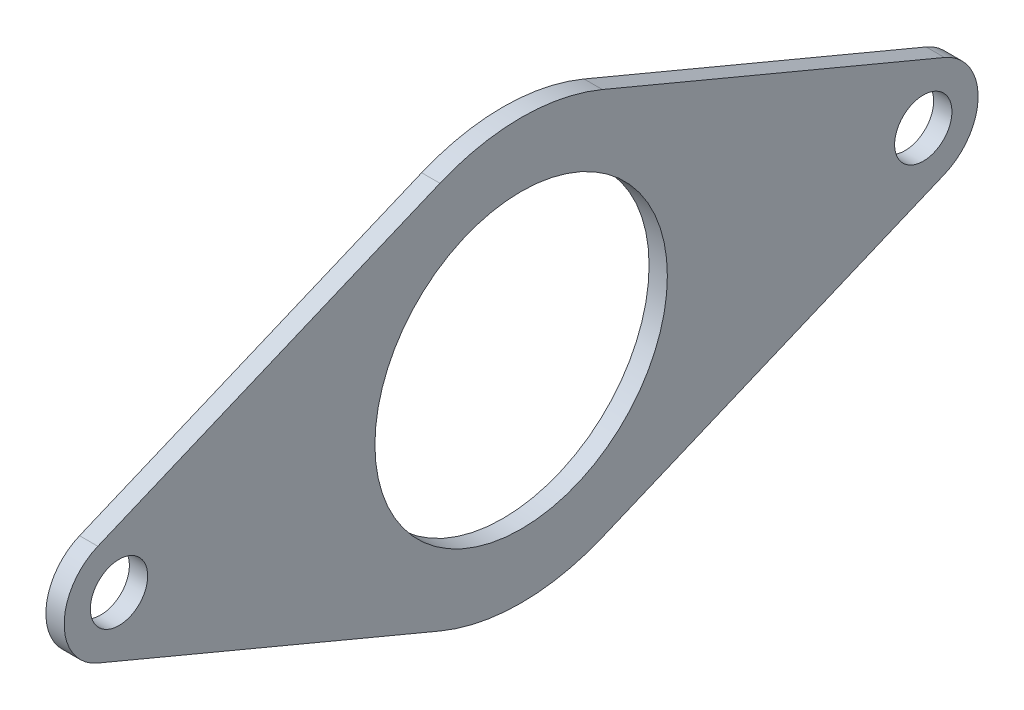
ISO-10303-21;
HEADER;
FILE_DESCRIPTION(('STEP AP214'),'2;1');
FILE_NAME('part.step','',(''),(''),'','','');
FILE_SCHEMA(('AUTOMOTIVE_DESIGN { 1 0 10303 214 1 1 1 1 }'));
ENDSEC;
DATA;
#1=APPLICATION_CONTEXT('core data for automotive mechanical design processes');
#2=APPLICATION_PROTOCOL_DEFINITION('international standard','automotive_design',2000,#1);
#3=PRODUCT_CONTEXT('',#1,'mechanical');
#4=PRODUCT('Part','Part','',(#3));
#5=PRODUCT_RELATED_PRODUCT_CATEGORY('part','',(#4));
#6=PRODUCT_DEFINITION_FORMATION('','',#4);
#7=PRODUCT_DEFINITION_CONTEXT('part definition',#1,'design');
#8=PRODUCT_DEFINITION('design','',#6,#7);
#9=PRODUCT_DEFINITION_SHAPE('','',#8);
#10=(LENGTH_UNIT() NAMED_UNIT(*) SI_UNIT(.MILLI.,.METRE.));
#11=(NAMED_UNIT(*) PLANE_ANGLE_UNIT() SI_UNIT($,.RADIAN.));
#12=(NAMED_UNIT(*) SI_UNIT($,.STERADIAN.) SOLID_ANGLE_UNIT());
#13=UNCERTAINTY_MEASURE_WITH_UNIT(LENGTH_MEASURE(1.E-05),#10,'distance_accuracy_value','');
#14=(GEOMETRIC_REPRESENTATION_CONTEXT(3) GLOBAL_UNCERTAINTY_ASSIGNED_CONTEXT((#13)) GLOBAL_UNIT_ASSIGNED_CONTEXT((#10,
#11,#12)) REPRESENTATION_CONTEXT('',''));
#15=CARTESIAN_POINT('',(0.,0.,0.));
#16=DIRECTION('',(0.,0.,1.));
#17=DIRECTION('',(1.,0.,0.));
#18=AXIS2_PLACEMENT_3D('',#15,#16,#17);
#19=CARTESIAN_POINT('',(0.79375,0.,34.925));
#20=DIRECTION('',(1.,0.,0.));
#21=DIRECTION('',(0.,0.,-1.));
#22=AXIS2_PLACEMENT_3D('',#19,#20,#21);
#23=PLANE('',#22);
#24=CARTESIAN_POINT('',(0.79375,0.,-34.925));
#25=DIRECTION('',(1.,0.,0.));
#26=DIRECTION('',(0.,0.,-1.));
#27=AXIS2_PLACEMENT_3D('',#24,#25,#26);
#28=CIRCLE('',#27,2.4892);
#29=CARTESIAN_POINT('',(0.79375,0.,-37.4142));
#30=VERTEX_POINT('',#29);
#31=EDGE_CURVE('E221',#30,#30,#28,.T.);
#32=ORIENTED_EDGE('',*,*,#31,.F.);
#33=EDGE_LOOP('',(#32));
#34=FACE_BOUND('',#33,.T.);
#35=CARTESIAN_POINT('',(0.79375,0.,34.925));
#36=DIRECTION('',(1.,0.,0.));
#37=DIRECTION('',(0.,0.,-1.));
#38=AXIS2_PLACEMENT_3D('',#35,#36,#37);
#39=CIRCLE('',#38,4.7625);
#40=CARTESIAN_POINT('',(0.79375,4.39267539841752,36.7650568181818));
#41=VERTEX_POINT('',#40);
#42=CARTESIAN_POINT('',(0.79375,-4.39267539841754,36.7650568181818));
#43=VERTEX_POINT('',#42);
#44=EDGE_CURVE('E172',#41,#43,#39,.T.);
#45=ORIENTED_EDGE('',*,*,#44,.T.);
#46=DIRECTION('',(0.,-0.386363636363636,-0.922346540350138));
#47=VECTOR('',#46,1.);
#48=CARTESIAN_POINT('',(0.79375,-4.39267539841754,36.7650568181818));
#49=LINE('',#48,#47);
#50=CARTESIAN_POINT('',(0.79375,-16.8385890272672,7.05355113636362));
#51=VERTEX_POINT('',#50);
#52=EDGE_CURVE('E108',#43,#51,#49,.T.);
#53=ORIENTED_EDGE('',*,*,#52,.T.);
#54=CARTESIAN_POINT('',(0.79375,0.,0.));
#55=DIRECTION('',(1.,0.,0.));
#56=DIRECTION('',(0.,0.,-1.));
#57=AXIS2_PLACEMENT_3D('',#54,#55,#56);
#58=CIRCLE('',#57,18.25625);
#59=CARTESIAN_POINT('',(0.79375,-16.8385890272672,-7.05355113636362));
#60=VERTEX_POINT('',#59);
#61=EDGE_CURVE('E193',#51,#60,#58,.T.);
#62=ORIENTED_EDGE('',*,*,#61,.T.);
#63=DIRECTION('',(0.,0.386363636363636,-0.922346540350138));
#64=VECTOR('',#63,1.);
#65=CARTESIAN_POINT('',(0.79375,-4.39267539841752,-36.7650568181818));
#66=LINE('',#65,#64);
#67=CARTESIAN_POINT('',(0.79375,-4.39267539841752,-36.7650568181818));
#68=VERTEX_POINT('',#67);
#69=EDGE_CURVE('E207',#60,#68,#66,.T.);
#70=ORIENTED_EDGE('',*,*,#69,.T.);
#71=CARTESIAN_POINT('',(0.79375,0.,-34.925));
#72=DIRECTION('',(1.,0.,0.));
#73=DIRECTION('',(0.,0.,-1.));
#74=AXIS2_PLACEMENT_3D('',#71,#72,#73);
#75=CIRCLE('',#74,4.7625);
#76=CARTESIAN_POINT('',(0.79375,4.39267539841754,-36.7650568181818));
#77=VERTEX_POINT('',#76);
#78=EDGE_CURVE('E127',#68,#77,#75,.T.);
#79=ORIENTED_EDGE('',*,*,#78,.T.);
#80=DIRECTION('',(0.,0.386363636363636,0.922346540350138));
#81=VECTOR('',#80,1.);
#82=CARTESIAN_POINT('',(0.79375,4.39267539841754,-36.7650568181818));
#83=LINE('',#82,#81);
#84=CARTESIAN_POINT('',(0.79375,16.8385890272672,-7.05355113636363));
#85=VERTEX_POINT('',#84);
#86=EDGE_CURVE('E121',#77,#85,#83,.T.);
#87=ORIENTED_EDGE('',*,*,#86,.T.);
#88=CARTESIAN_POINT('',(0.79375,0.,0.));
#89=DIRECTION('',(1.,0.,0.));
#90=DIRECTION('',(0.,0.,-1.));
#91=AXIS2_PLACEMENT_3D('',#88,#89,#90);
#92=CIRCLE('',#91,18.25625);
#93=CARTESIAN_POINT('',(0.79375,16.8385890272672,7.05355113636364));
#94=VERTEX_POINT('',#93);
#95=EDGE_CURVE('E125',#85,#94,#92,.T.);
#96=ORIENTED_EDGE('',*,*,#95,.T.);
#97=DIRECTION('',(0.,-0.386363636363637,0.922346540350137));
#98=VECTOR('',#97,1.);
#99=CARTESIAN_POINT('',(0.79375,4.39267539841752,36.7650568181818));
#100=LINE('',#99,#98);
#101=EDGE_CURVE('E65',#94,#41,#100,.T.);
#102=ORIENTED_EDGE('',*,*,#101,.T.);
#103=EDGE_LOOP('',(#45,#53,#62,#70,#79,#87,#96,#102));
#104=FACE_BOUND('',#103,.T.);
#105=CARTESIAN_POINT('',(0.79375,0.,0.));
#106=DIRECTION('',(1.,0.,0.));
#107=DIRECTION('',(0.,0.,-1.));
#108=AXIS2_PLACEMENT_3D('',#105,#106,#107);
#109=CIRCLE('',#108,12.7);
#110=CARTESIAN_POINT('',(0.79375,0.,-12.7));
#111=VERTEX_POINT('',#110);
#112=EDGE_CURVE('E154',#111,#111,#109,.T.);
#113=ORIENTED_EDGE('',*,*,#112,.F.);
#114=EDGE_LOOP('',(#113));
#115=FACE_BOUND('',#114,.T.);
#116=CARTESIAN_POINT('',(0.79375,0.,34.925));
#117=DIRECTION('',(1.,0.,0.));
#118=DIRECTION('',(0.,0.,-1.));
#119=AXIS2_PLACEMENT_3D('',#116,#117,#118);
#120=CIRCLE('',#119,2.4892);
#121=CARTESIAN_POINT('',(0.79375,0.,32.4358));
#122=VERTEX_POINT('',#121);
#123=EDGE_CURVE('E229',#122,#122,#120,.T.);
#124=ORIENTED_EDGE('',*,*,#123,.F.);
#125=EDGE_LOOP('',(#124));
#126=FACE_BOUND('',#125,.T.);
#127=ADVANCED_FACE('F47',(#34,#104,#115,#126),#23,.T.);
#128=CARTESIAN_POINT('',(-0.79375,0.,34.925));
#129=DIRECTION('',(1.,0.,0.));
#130=DIRECTION('',(0.,0.,-1.));
#131=AXIS2_PLACEMENT_3D('',#128,#129,#130);
#132=PLANE('',#131);
#133=CARTESIAN_POINT('',(-0.79375,0.,34.925));
#134=DIRECTION('',(1.,0.,0.));
#135=DIRECTION('',(0.,0.,-1.));
#136=AXIS2_PLACEMENT_3D('',#133,#134,#135);
#137=CIRCLE('',#136,4.7625);
#138=CARTESIAN_POINT('',(-0.79375,4.39267539841752,36.7650568181818));
#139=VERTEX_POINT('',#138);
#140=CARTESIAN_POINT('',(-0.79375,-4.39267539841754,36.7650568181818));
#141=VERTEX_POINT('',#140);
#142=EDGE_CURVE('E149',#139,#141,#137,.T.);
#143=ORIENTED_EDGE('',*,*,#142,.F.);
#144=DIRECTION('',(0.,-0.386363636363637,0.922346540350137));
#145=VECTOR('',#144,1.);
#146=CARTESIAN_POINT('',(-0.79375,4.39267539841752,36.7650568181818));
#147=LINE('',#146,#145);
#148=CARTESIAN_POINT('',(-0.79375,16.8385890272672,7.05355113636364));
#149=VERTEX_POINT('',#148);
#150=EDGE_CURVE('E100',#149,#139,#147,.T.);
#151=ORIENTED_EDGE('',*,*,#150,.F.);
#152=CARTESIAN_POINT('',(-0.79375,0.,0.));
#153=DIRECTION('',(1.,0.,0.));
#154=DIRECTION('',(0.,0.,-1.));
#155=AXIS2_PLACEMENT_3D('',#152,#153,#154);
#156=CIRCLE('',#155,18.25625);
#157=CARTESIAN_POINT('',(-0.79375,16.8385890272672,-7.05355113636363));
#158=VERTEX_POINT('',#157);
#159=EDGE_CURVE('E94',#158,#149,#156,.T.);
#160=ORIENTED_EDGE('',*,*,#159,.F.);
#161=DIRECTION('',(0.,0.386363636363636,0.922346540350138));
#162=VECTOR('',#161,1.);
#163=CARTESIAN_POINT('',(-0.79375,4.39267539841754,-36.7650568181818));
#164=LINE('',#163,#162);
#165=CARTESIAN_POINT('',(-0.79375,4.39267539841754,-36.7650568181818));
#166=VERTEX_POINT('',#165);
#167=EDGE_CURVE('E136',#166,#158,#164,.T.);
#168=ORIENTED_EDGE('',*,*,#167,.F.);
#169=CARTESIAN_POINT('',(-0.79375,0.,-34.925));
#170=DIRECTION('',(1.,0.,0.));
#171=DIRECTION('',(0.,0.,-1.));
#172=AXIS2_PLACEMENT_3D('',#169,#170,#171);
#173=CIRCLE('',#172,4.7625);
#174=CARTESIAN_POINT('',(-0.79375,-4.39267539841752,-36.7650568181818));
#175=VERTEX_POINT('',#174);
#176=EDGE_CURVE('E163',#175,#166,#173,.T.);
#177=ORIENTED_EDGE('',*,*,#176,.F.);
#178=DIRECTION('',(0.,0.386363636363636,-0.922346540350138));
#179=VECTOR('',#178,1.);
#180=CARTESIAN_POINT('',(-0.79375,-4.39267539841752,-36.7650568181818));
#181=LINE('',#180,#179);
#182=CARTESIAN_POINT('',(-0.79375,-16.8385890272672,-7.05355113636362));
#183=VERTEX_POINT('',#182);
#184=EDGE_CURVE('E160',#183,#175,#181,.T.);
#185=ORIENTED_EDGE('',*,*,#184,.F.);
#186=CARTESIAN_POINT('',(-0.79375,0.,0.));
#187=DIRECTION('',(1.,0.,0.));
#188=DIRECTION('',(0.,0.,-1.));
#189=AXIS2_PLACEMENT_3D('',#186,#187,#188);
#190=CIRCLE('',#189,18.25625);
#191=CARTESIAN_POINT('',(-0.79375,-16.8385890272672,7.05355113636362));
#192=VERTEX_POINT('',#191);
#193=EDGE_CURVE('E157',#192,#183,#190,.T.);
#194=ORIENTED_EDGE('',*,*,#193,.F.);
#195=DIRECTION('',(0.,-0.386363636363636,-0.922346540350138));
#196=VECTOR('',#195,1.);
#197=CARTESIAN_POINT('',(-0.79375,-4.39267539841754,36.7650568181818));
#198=LINE('',#197,#196);
#199=EDGE_CURVE('E153',#141,#192,#198,.T.);
#200=ORIENTED_EDGE('',*,*,#199,.F.);
#201=EDGE_LOOP('',(#143,#151,#160,#168,#177,#185,#194,#200));
#202=FACE_BOUND('',#201,.T.);
#203=CARTESIAN_POINT('',(-0.79375,0.,0.));
#204=DIRECTION('',(1.,0.,0.));
#205=DIRECTION('',(0.,0.,-1.));
#206=AXIS2_PLACEMENT_3D('',#203,#204,#205);
#207=CIRCLE('',#206,12.7);
#208=CARTESIAN_POINT('',(-0.79375,0.,-12.7));
#209=VERTEX_POINT('',#208);
#210=EDGE_CURVE('E217',#209,#209,#207,.T.);
#211=ORIENTED_EDGE('',*,*,#210,.T.);
#212=EDGE_LOOP('',(#211));
#213=FACE_BOUND('',#212,.T.);
#214=CARTESIAN_POINT('',(-0.79375,0.,-34.925));
#215=DIRECTION('',(1.,0.,0.));
#216=DIRECTION('',(0.,0.,-1.));
#217=AXIS2_PLACEMENT_3D('',#214,#215,#216);
#218=CIRCLE('',#217,2.4892);
#219=CARTESIAN_POINT('',(-0.79375,0.,-37.4142));
#220=VERTEX_POINT('',#219);
#221=EDGE_CURVE('E225',#220,#220,#218,.T.);
#222=ORIENTED_EDGE('',*,*,#221,.T.);
#223=EDGE_LOOP('',(#222));
#224=FACE_BOUND('',#223,.T.);
#225=CARTESIAN_POINT('',(-0.79375,0.,34.925));
#226=DIRECTION('',(1.,0.,0.));
#227=DIRECTION('',(0.,0.,-1.));
#228=AXIS2_PLACEMENT_3D('',#225,#226,#227);
#229=CIRCLE('',#228,2.4892);
#230=CARTESIAN_POINT('',(-0.79375,0.,32.4358));
#231=VERTEX_POINT('',#230);
#232=EDGE_CURVE('E233',#231,#231,#229,.T.);
#233=ORIENTED_EDGE('',*,*,#232,.T.);
#234=EDGE_LOOP('',(#233));
#235=FACE_BOUND('',#234,.T.);
#236=ADVANCED_FACE('F197',(#202,#213,#224,#235),#132,.F.);
#237=CARTESIAN_POINT('',(0.79375,0.,34.925));
#238=DIRECTION('',(-1.,0.,0.));
#239=DIRECTION('',(0.,0.,1.));
#240=AXIS2_PLACEMENT_3D('',#237,#238,#239);
#241=CYLINDRICAL_SURFACE('',#240,4.7625);
#242=ORIENTED_EDGE('',*,*,#142,.T.);
#243=DIRECTION('',(-1.,0.,0.));
#244=VECTOR('',#243,1.);
#245=CARTESIAN_POINT('',(0.79375,-4.39267539841754,36.7650568181818));
#246=LINE('',#245,#244);
#247=EDGE_CURVE('E11',#43,#141,#246,.T.);
#248=ORIENTED_EDGE('',*,*,#247,.F.);
#249=ORIENTED_EDGE('',*,*,#44,.F.);
#250=DIRECTION('',(-1.,0.,0.));
#251=VECTOR('',#250,1.);
#252=CARTESIAN_POINT('',(0.79375,4.39267539841752,36.7650568181818));
#253=LINE('',#252,#251);
#254=EDGE_CURVE('E145',#41,#139,#253,.T.);
#255=ORIENTED_EDGE('',*,*,#254,.T.);
#256=EDGE_LOOP('',(#242,#248,#249,#255));
#257=FACE_BOUND('',#256,.T.);
#258=ADVANCED_FACE('F49',(#257),#241,.T.);
#259=CARTESIAN_POINT('',(0.79375,-4.39267539841754,36.7650568181818));
#260=DIRECTION('',(0.,0.922346540350138,-0.386363636363636));
#261=DIRECTION('',(0.,0.386363636363636,0.922346540350138));
#262=AXIS2_PLACEMENT_3D('',#259,#260,#261);
#263=PLANE('',#262);
#264=ORIENTED_EDGE('',*,*,#199,.T.);
#265=DIRECTION('',(-1.,0.,0.));
#266=VECTOR('',#265,1.);
#267=CARTESIAN_POINT('',(0.79375,-16.8385890272672,7.05355113636362));
#268=LINE('',#267,#266);
#269=EDGE_CURVE('E57',#51,#192,#268,.T.);
#270=ORIENTED_EDGE('',*,*,#269,.F.);
#271=ORIENTED_EDGE('',*,*,#52,.F.);
#272=ORIENTED_EDGE('',*,*,#247,.T.);
#273=EDGE_LOOP('',(#264,#270,#271,#272));
#274=FACE_BOUND('',#273,.T.);
#275=ADVANCED_FACE('F268',(#274),#263,.F.);
#276=CARTESIAN_POINT('',(0.79375,0.,0.));
#277=DIRECTION('',(-1.,0.,0.));
#278=DIRECTION('',(0.,0.,1.));
#279=AXIS2_PLACEMENT_3D('',#276,#277,#278);
#280=CYLINDRICAL_SURFACE('',#279,18.25625);
#281=ORIENTED_EDGE('',*,*,#193,.T.);
#282=DIRECTION('',(-1.,0.,0.));
#283=VECTOR('',#282,1.);
#284=CARTESIAN_POINT('',(0.79375,-16.8385890272672,-7.05355113636362));
#285=LINE('',#284,#283);
#286=EDGE_CURVE('E183',#60,#183,#285,.T.);
#287=ORIENTED_EDGE('',*,*,#286,.F.);
#288=ORIENTED_EDGE('',*,*,#61,.F.);
#289=ORIENTED_EDGE('',*,*,#269,.T.);
#290=EDGE_LOOP('',(#281,#287,#288,#289));
#291=FACE_BOUND('',#290,.T.);
#292=ADVANCED_FACE('F191',(#291),#280,.T.);
#293=CARTESIAN_POINT('',(0.79375,-4.39267539841752,-36.7650568181818));
#294=DIRECTION('',(0.,0.922346540350137,0.386363636363636));
#295=DIRECTION('',(0.,-0.386363636363636,0.922346540350138));
#296=AXIS2_PLACEMENT_3D('',#293,#294,#295);
#297=PLANE('',#296);
#298=ORIENTED_EDGE('',*,*,#184,.T.);
#299=DIRECTION('',(-1.,0.,0.));
#300=VECTOR('',#299,1.);
#301=CARTESIAN_POINT('',(0.79375,-4.39267539841752,-36.7650568181818));
#302=LINE('',#301,#300);
#303=EDGE_CURVE('E179',#68,#175,#302,.T.);
#304=ORIENTED_EDGE('',*,*,#303,.F.);
#305=ORIENTED_EDGE('',*,*,#69,.F.);
#306=ORIENTED_EDGE('',*,*,#286,.T.);
#307=EDGE_LOOP('',(#298,#304,#305,#306));
#308=FACE_BOUND('',#307,.T.);
#309=ADVANCED_FACE('F202',(#308),#297,.F.);
#310=CARTESIAN_POINT('',(0.79375,0.,-34.925));
#311=DIRECTION('',(-1.,0.,0.));
#312=DIRECTION('',(0.,0.,1.));
#313=AXIS2_PLACEMENT_3D('',#310,#311,#312);
#314=CYLINDRICAL_SURFACE('',#313,4.7625);
#315=ORIENTED_EDGE('',*,*,#176,.T.);
#316=DIRECTION('',(-1.,0.,0.));
#317=VECTOR('',#316,1.);
#318=CARTESIAN_POINT('',(0.79375,4.39267539841754,-36.7650568181818));
#319=LINE('',#318,#317);
#320=EDGE_CURVE('E138',#77,#166,#319,.T.);
#321=ORIENTED_EDGE('',*,*,#320,.F.);
#322=ORIENTED_EDGE('',*,*,#78,.F.);
#323=ORIENTED_EDGE('',*,*,#303,.T.);
#324=EDGE_LOOP('',(#315,#321,#322,#323));
#325=FACE_BOUND('',#324,.T.);
#326=ADVANCED_FACE('F205',(#325),#314,.T.);
#327=CARTESIAN_POINT('',(0.79375,4.39267539841754,-36.7650568181818));
#328=DIRECTION('',(0.,-0.922346540350138,0.386363636363636));
#329=DIRECTION('',(0.,-0.386363636363636,-0.922346540350138));
#330=AXIS2_PLACEMENT_3D('',#327,#328,#329);
#331=PLANE('',#330);
#332=ORIENTED_EDGE('',*,*,#167,.T.);
#333=DIRECTION('',(-1.,0.,0.));
#334=VECTOR('',#333,1.);
#335=CARTESIAN_POINT('',(0.79375,16.8385890272672,-7.05355113636363));
#336=LINE('',#335,#334);
#337=EDGE_CURVE('E133',#85,#158,#336,.T.);
#338=ORIENTED_EDGE('',*,*,#337,.F.);
#339=ORIENTED_EDGE('',*,*,#86,.F.);
#340=ORIENTED_EDGE('',*,*,#320,.T.);
#341=EDGE_LOOP('',(#332,#338,#339,#340));
#342=FACE_BOUND('',#341,.T.);
#343=ADVANCED_FACE('F134',(#342),#331,.F.);
#344=CARTESIAN_POINT('',(0.79375,0.,0.));
#345=DIRECTION('',(-1.,0.,0.));
#346=DIRECTION('',(0.,0.,1.));
#347=AXIS2_PLACEMENT_3D('',#344,#345,#346);
#348=CYLINDRICAL_SURFACE('',#347,18.25625);
#349=ORIENTED_EDGE('',*,*,#159,.T.);
#350=DIRECTION('',(-1.,0.,0.));
#351=VECTOR('',#350,1.);
#352=CARTESIAN_POINT('',(0.79375,16.8385890272672,7.05355113636364));
#353=LINE('',#352,#351);
#354=EDGE_CURVE('E139',#94,#149,#353,.T.);
#355=ORIENTED_EDGE('',*,*,#354,.F.);
#356=ORIENTED_EDGE('',*,*,#95,.F.);
#357=ORIENTED_EDGE('',*,*,#337,.T.);
#358=EDGE_LOOP('',(#349,#355,#356,#357));
#359=FACE_BOUND('',#358,.T.);
#360=ADVANCED_FACE('F141',(#359),#348,.T.);
#361=CARTESIAN_POINT('',(0.79375,4.39267539841752,36.7650568181818));
#362=DIRECTION('',(0.,-0.922346540350137,-0.386363636363637));
#363=DIRECTION('',(0.,0.386363636363637,-0.922346540350137));
#364=AXIS2_PLACEMENT_3D('',#361,#362,#363);
#365=PLANE('',#364);
#366=ORIENTED_EDGE('',*,*,#150,.T.);
#367=ORIENTED_EDGE('',*,*,#254,.F.);
#368=ORIENTED_EDGE('',*,*,#101,.F.);
#369=ORIENTED_EDGE('',*,*,#354,.T.);
#370=EDGE_LOOP('',(#366,#367,#368,#369));
#371=FACE_BOUND('',#370,.T.);
#372=ADVANCED_FACE('F256',(#371),#365,.F.);
#373=CARTESIAN_POINT('',(0.79375,0.,0.));
#374=DIRECTION('',(-1.,0.,0.));
#375=DIRECTION('',(0.,0.,1.));
#376=AXIS2_PLACEMENT_3D('',#373,#374,#375);
#377=CYLINDRICAL_SURFACE('',#376,12.7);
#378=ORIENTED_EDGE('',*,*,#112,.T.);
#379=EDGE_LOOP('',(#378));
#380=FACE_BOUND('',#379,.T.);
#381=ORIENTED_EDGE('',*,*,#210,.F.);
#382=EDGE_LOOP('',(#381));
#383=FACE_BOUND('',#382,.T.);
#384=ADVANCED_FACE('F253',(#380,#383),#377,.F.);
#385=CARTESIAN_POINT('',(0.79375,0.,-34.925));
#386=DIRECTION('',(-1.,0.,0.));
#387=DIRECTION('',(0.,0.,1.));
#388=AXIS2_PLACEMENT_3D('',#385,#386,#387);
#389=CYLINDRICAL_SURFACE('',#388,2.4892);
#390=ORIENTED_EDGE('',*,*,#31,.T.);
#391=EDGE_LOOP('',(#390));
#392=FACE_BOUND('',#391,.T.);
#393=ORIENTED_EDGE('',*,*,#221,.F.);
#394=EDGE_LOOP('',(#393));
#395=FACE_BOUND('',#394,.T.);
#396=ADVANCED_FACE('F331',(#392,#395),#389,.F.);
#397=CARTESIAN_POINT('',(0.79375,0.,34.925));
#398=DIRECTION('',(-1.,0.,0.));
#399=DIRECTION('',(0.,0.,1.));
#400=AXIS2_PLACEMENT_3D('',#397,#398,#399);
#401=CYLINDRICAL_SURFACE('',#400,2.4892);
#402=ORIENTED_EDGE('',*,*,#123,.T.);
#403=EDGE_LOOP('',(#402));
#404=FACE_BOUND('',#403,.T.);
#405=ORIENTED_EDGE('',*,*,#232,.F.);
#406=EDGE_LOOP('',(#405));
#407=FACE_BOUND('',#406,.T.);
#408=ADVANCED_FACE('F241',(#404,#407),#401,.F.);
#409=CLOSED_SHELL('',(#127,#236,#258,#275,#292,#309,#326,#343,#360,#372,#384,#396,#408));
#410=MANIFOLD_SOLID_BREP('B2',#409);
#411=ADVANCED_BREP_SHAPE_REPRESENTATION('',(#18,#410),#14);
#412=SHAPE_DEFINITION_REPRESENTATION(#9,#411);
ENDSEC;
END-ISO-10303-21;
